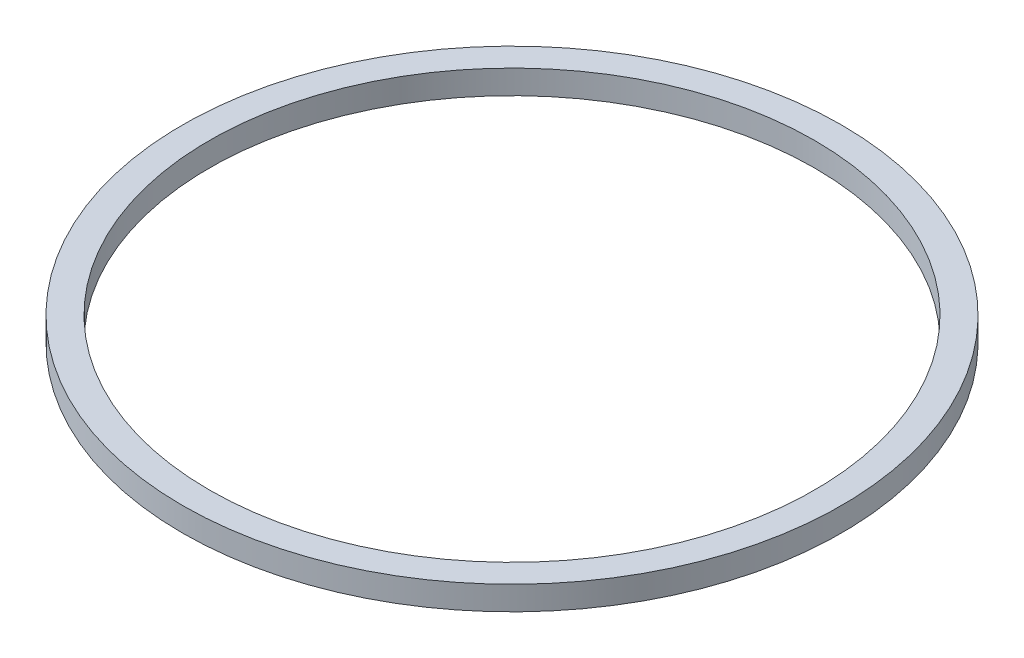
ISO-10303-21;
HEADER;
FILE_DESCRIPTION(('STEP AP214'),'2;1');
FILE_NAME('part.step','',(''),(''),'','','');
FILE_SCHEMA(('AUTOMOTIVE_DESIGN { 1 0 10303 214 1 1 1 1 }'));
ENDSEC;
DATA;
#1=APPLICATION_CONTEXT('core data for automotive mechanical design processes');
#2=APPLICATION_PROTOCOL_DEFINITION('international standard','automotive_design',2000,#1);
#3=PRODUCT_CONTEXT('',#1,'mechanical');
#4=PRODUCT('Part','Part','',(#3));
#5=PRODUCT_RELATED_PRODUCT_CATEGORY('part','',(#4));
#6=PRODUCT_DEFINITION_FORMATION('','',#4);
#7=PRODUCT_DEFINITION_CONTEXT('part definition',#1,'design');
#8=PRODUCT_DEFINITION('design','',#6,#7);
#9=PRODUCT_DEFINITION_SHAPE('','',#8);
#10=(LENGTH_UNIT() NAMED_UNIT(*) SI_UNIT(.MILLI.,.METRE.));
#11=(NAMED_UNIT(*) PLANE_ANGLE_UNIT() SI_UNIT($,.RADIAN.));
#12=(NAMED_UNIT(*) SI_UNIT($,.STERADIAN.) SOLID_ANGLE_UNIT());
#13=UNCERTAINTY_MEASURE_WITH_UNIT(LENGTH_MEASURE(1.E-05),#10,'distance_accuracy_value','');
#14=(GEOMETRIC_REPRESENTATION_CONTEXT(3) GLOBAL_UNCERTAINTY_ASSIGNED_CONTEXT((#13)) GLOBAL_UNIT_ASSIGNED_CONTEXT((#10,
#11,#12)) REPRESENTATION_CONTEXT('',''));
#15=CARTESIAN_POINT('',(0.,0.,0.));
#16=DIRECTION('',(0.,0.,1.));
#17=DIRECTION('',(1.,0.,0.));
#18=AXIS2_PLACEMENT_3D('',#15,#16,#17);
#19=CARTESIAN_POINT('',(0.,6.35,0.));
#20=DIRECTION('',(0.,1.,0.));
#21=DIRECTION('',(0.,0.,1.));
#22=AXIS2_PLACEMENT_3D('',#19,#20,#21);
#23=PLANE('',#22);
#24=CARTESIAN_POINT('',(0.,6.35,0.));
#25=DIRECTION('',(0.,1.,0.));
#26=DIRECTION('',(0.,0.,1.));
#27=AXIS2_PLACEMENT_3D('',#24,#25,#26);
#28=CIRCLE('',#27,87.5284);
#29=CARTESIAN_POINT('',(0.,6.35,87.5284));
#30=VERTEX_POINT('',#29);
#31=EDGE_CURVE('E10',#30,#30,#28,.T.);
#32=ORIENTED_EDGE('',*,*,#31,.T.);
#33=EDGE_LOOP('',(#32));
#34=FACE_BOUND('',#33,.T.);
#35=CARTESIAN_POINT('',(0.,6.35,0.));
#36=DIRECTION('',(0.,1.,0.));
#37=DIRECTION('',(0.,0.,1.));
#38=AXIS2_PLACEMENT_3D('',#35,#36,#37);
#39=CIRCLE('',#38,80.391);
#40=CARTESIAN_POINT('',(0.,6.35,80.391));
#41=VERTEX_POINT('',#40);
#42=EDGE_CURVE('E42',#41,#41,#39,.T.);
#43=ORIENTED_EDGE('',*,*,#42,.F.);
#44=EDGE_LOOP('',(#43));
#45=FACE_BOUND('',#44,.T.);
#46=ADVANCED_FACE('F31',(#34,#45),#23,.T.);
#47=CARTESIAN_POINT('',(0.,0.,0.));
#48=DIRECTION('',(0.,1.,0.));
#49=DIRECTION('',(0.,0.,1.));
#50=AXIS2_PLACEMENT_3D('',#47,#48,#49);
#51=PLANE('',#50);
#52=CARTESIAN_POINT('',(0.,0.,0.));
#53=DIRECTION('',(0.,1.,0.));
#54=DIRECTION('',(0.,0.,1.));
#55=AXIS2_PLACEMENT_3D('',#52,#53,#54);
#56=CIRCLE('',#55,87.5284);
#57=CARTESIAN_POINT('',(0.,0.,87.5284));
#58=VERTEX_POINT('',#57);
#59=EDGE_CURVE('E35',#58,#58,#56,.T.);
#60=ORIENTED_EDGE('',*,*,#59,.F.);
#61=EDGE_LOOP('',(#60));
#62=FACE_BOUND('',#61,.T.);
#63=CARTESIAN_POINT('',(0.,0.,0.));
#64=DIRECTION('',(0.,1.,0.));
#65=DIRECTION('',(0.,0.,1.));
#66=AXIS2_PLACEMENT_3D('',#63,#64,#65);
#67=CIRCLE('',#66,80.391);
#68=CARTESIAN_POINT('',(0.,0.,80.391));
#69=VERTEX_POINT('',#68);
#70=EDGE_CURVE('E44',#69,#69,#67,.T.);
#71=ORIENTED_EDGE('',*,*,#70,.T.);
#72=EDGE_LOOP('',(#71));
#73=FACE_BOUND('',#72,.T.);
#74=ADVANCED_FACE('F54',(#62,#73),#51,.F.);
#75=CARTESIAN_POINT('',(0.,6.35,0.));
#76=DIRECTION('',(0.,-1.,0.));
#77=DIRECTION('',(0.,0.,-1.));
#78=AXIS2_PLACEMENT_3D('',#75,#76,#77);
#79=CYLINDRICAL_SURFACE('',#78,87.5284);
#80=ORIENTED_EDGE('',*,*,#31,.F.);
#81=EDGE_LOOP('',(#80));
#82=FACE_BOUND('',#81,.T.);
#83=ORIENTED_EDGE('',*,*,#59,.T.);
#84=EDGE_LOOP('',(#83));
#85=FACE_BOUND('',#84,.T.);
#86=ADVANCED_FACE('F33',(#82,#85),#79,.T.);
#87=CARTESIAN_POINT('',(0.,6.35,0.));
#88=DIRECTION('',(0.,-1.,0.));
#89=DIRECTION('',(0.,0.,-1.));
#90=AXIS2_PLACEMENT_3D('',#87,#88,#89);
#91=CYLINDRICAL_SURFACE('',#90,80.391);
#92=ORIENTED_EDGE('',*,*,#42,.T.);
#93=EDGE_LOOP('',(#92));
#94=FACE_BOUND('',#93,.T.);
#95=ORIENTED_EDGE('',*,*,#70,.F.);
#96=EDGE_LOOP('',(#95));
#97=FACE_BOUND('',#96,.T.);
#98=ADVANCED_FACE('F50',(#94,#97),#91,.F.);
#99=CLOSED_SHELL('',(#46,#74,#86,#98));
#100=MANIFOLD_SOLID_BREP('B2',#99);
#101=ADVANCED_BREP_SHAPE_REPRESENTATION('',(#18,#100),#14);
#102=SHAPE_DEFINITION_REPRESENTATION(#9,#101);
ENDSEC;
END-ISO-10303-21;
